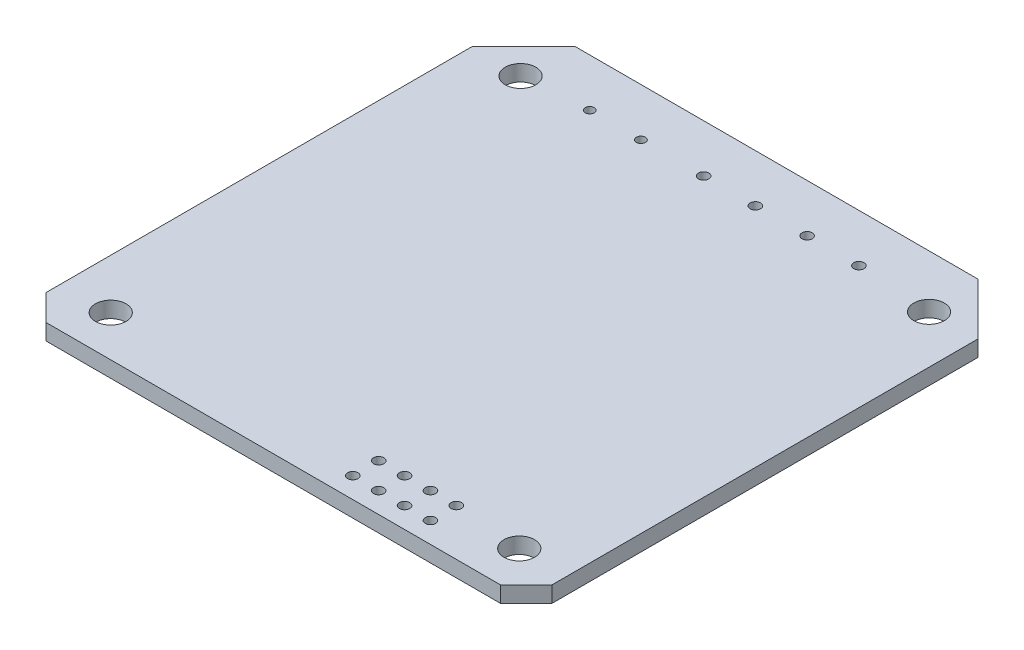
ISO-10303-21;
HEADER;
FILE_DESCRIPTION(('STEP AP214'),'2;1');
FILE_NAME('part.step','',(''),(''),'','','');
FILE_SCHEMA(('AUTOMOTIVE_DESIGN { 1 0 10303 214 1 1 1 1 }'));
ENDSEC;
DATA;
#1=APPLICATION_CONTEXT('core data for automotive mechanical design processes');
#2=APPLICATION_PROTOCOL_DEFINITION('international standard','automotive_design',2000,#1);
#3=PRODUCT_CONTEXT('',#1,'mechanical');
#4=PRODUCT('Part','Part','',(#3));
#5=PRODUCT_RELATED_PRODUCT_CATEGORY('part','',(#4));
#6=PRODUCT_DEFINITION_FORMATION('','',#4);
#7=PRODUCT_DEFINITION_CONTEXT('part definition',#1,'design');
#8=PRODUCT_DEFINITION('design','',#6,#7);
#9=PRODUCT_DEFINITION_SHAPE('','',#8);
#10=(LENGTH_UNIT() NAMED_UNIT(*) SI_UNIT(.MILLI.,.METRE.));
#11=(NAMED_UNIT(*) PLANE_ANGLE_UNIT() SI_UNIT($,.RADIAN.));
#12=(NAMED_UNIT(*) SI_UNIT($,.STERADIAN.) SOLID_ANGLE_UNIT());
#13=UNCERTAINTY_MEASURE_WITH_UNIT(LENGTH_MEASURE(1.E-05),#10,'distance_accuracy_value','');
#14=(GEOMETRIC_REPRESENTATION_CONTEXT(3) GLOBAL_UNCERTAINTY_ASSIGNED_CONTEXT((#13)) GLOBAL_UNIT_ASSIGNED_CONTEXT((#10,
#11,#12)) REPRESENTATION_CONTEXT('',''));
#15=CARTESIAN_POINT('',(0.,0.,0.));
#16=DIRECTION('',(0.,0.,1.));
#17=DIRECTION('',(1.,0.,0.));
#18=AXIS2_PLACEMENT_3D('',#15,#16,#17);
#19=CARTESIAN_POINT('',(24.8285,1.5748,24.7015));
#20=DIRECTION('',(-1.,0.,0.));
#21=DIRECTION('',(0.,0.,1.));
#22=AXIS2_PLACEMENT_3D('',#19,#20,#21);
#23=PLANE('',#22);
#24=DIRECTION('',(0.,0.,-1.));
#25=VECTOR('',#24,1.);
#26=CARTESIAN_POINT('',(24.8285,1.5748,24.7015));
#27=LINE('',#26,#25);
#28=CARTESIAN_POINT('',(24.8285,1.5748,22.1615));
#29=VERTEX_POINT('',#28);
#30=CARTESIAN_POINT('',(24.8285,1.5748,-19.6215));
#31=VERTEX_POINT('',#30);
#32=EDGE_CURVE('E139',#29,#31,#27,.T.);
#33=ORIENTED_EDGE('',*,*,#32,.F.);
#34=DIRECTION('',(0.,-1.,0.));
#35=VECTOR('',#34,1.);
#36=CARTESIAN_POINT('',(24.8285,1.5748,22.1615));
#37=LINE('',#36,#35);
#38=CARTESIAN_POINT('',(24.8285,0.,22.1615));
#39=VERTEX_POINT('',#38);
#40=EDGE_CURVE('E151',#29,#39,#37,.T.);
#41=ORIENTED_EDGE('',*,*,#40,.T.);
#42=DIRECTION('',(0.,0.,-1.));
#43=VECTOR('',#42,1.);
#44=CARTESIAN_POINT('',(24.8285,0.,24.7015));
#45=LINE('',#44,#43);
#46=CARTESIAN_POINT('',(24.8285,0.,-19.6215));
#47=VERTEX_POINT('',#46);
#48=EDGE_CURVE('E130',#39,#47,#45,.T.);
#49=ORIENTED_EDGE('',*,*,#48,.T.);
#50=DIRECTION('',(0.,1.,0.));
#51=VECTOR('',#50,1.);
#52=CARTESIAN_POINT('',(24.8285,1.5748,-19.6215));
#53=LINE('',#52,#51);
#54=EDGE_CURVE('E111',#47,#31,#53,.T.);
#55=ORIENTED_EDGE('',*,*,#54,.T.);
#56=EDGE_LOOP('',(#33,#41,#49,#55));
#57=FACE_BOUND('',#56,.T.);
#58=ADVANCED_FACE('F35',(#57),#23,.F.);
#59=CARTESIAN_POINT('',(-24.8285,1.5748,-24.7015));
#60=DIRECTION('',(0.,0.,1.));
#61=DIRECTION('',(1.,0.,0.));
#62=AXIS2_PLACEMENT_3D('',#59,#60,#61);
#63=PLANE('',#62);
#64=DIRECTION('',(-1.,0.,0.));
#65=VECTOR('',#64,1.);
#66=CARTESIAN_POINT('',(-24.8285,1.5748,-24.7015));
#67=LINE('',#66,#65);
#68=CARTESIAN_POINT('',(19.7485,1.5748,-24.7015));
#69=VERTEX_POINT('',#68);
#70=CARTESIAN_POINT('',(-19.7485,1.5748,-24.7015));
#71=VERTEX_POINT('',#70);
#72=EDGE_CURVE('E124',#69,#71,#67,.T.);
#73=ORIENTED_EDGE('',*,*,#72,.F.);
#74=DIRECTION('',(0.,-1.,0.));
#75=VECTOR('',#74,1.);
#76=CARTESIAN_POINT('',(19.7485,1.5748,-24.7015));
#77=LINE('',#76,#75);
#78=CARTESIAN_POINT('',(19.7485,0.,-24.7015));
#79=VERTEX_POINT('',#78);
#80=EDGE_CURVE('E109',#69,#79,#77,.T.);
#81=ORIENTED_EDGE('',*,*,#80,.T.);
#82=DIRECTION('',(-1.,0.,0.));
#83=VECTOR('',#82,1.);
#84=CARTESIAN_POINT('',(-24.8285,0.,-24.7015));
#85=LINE('',#84,#83);
#86=CARTESIAN_POINT('',(-19.7485,0.,-24.7015));
#87=VERTEX_POINT('',#86);
#88=EDGE_CURVE('E121',#79,#87,#85,.T.);
#89=ORIENTED_EDGE('',*,*,#88,.T.);
#90=DIRECTION('',(0.,1.,0.));
#91=VECTOR('',#90,1.);
#92=CARTESIAN_POINT('',(-19.7485,1.5748,-24.7015));
#93=LINE('',#92,#91);
#94=EDGE_CURVE('E125',#87,#71,#93,.T.);
#95=ORIENTED_EDGE('',*,*,#94,.T.);
#96=EDGE_LOOP('',(#73,#81,#89,#95));
#97=FACE_BOUND('',#96,.T.);
#98=ADVANCED_FACE('F120',(#97),#63,.F.);
#99=CARTESIAN_POINT('',(-24.8285,1.5748,24.7015));
#100=DIRECTION('',(1.,0.,0.));
#101=DIRECTION('',(0.,0.,-1.));
#102=AXIS2_PLACEMENT_3D('',#99,#100,#101);
#103=PLANE('',#102);
#104=DIRECTION('',(0.,0.,1.));
#105=VECTOR('',#104,1.);
#106=CARTESIAN_POINT('',(-24.8285,0.,24.7015));
#107=LINE('',#106,#105);
#108=CARTESIAN_POINT('',(-24.8285,0.,-19.6215));
#109=VERTEX_POINT('',#108);
#110=CARTESIAN_POINT('',(-24.8285,0.,22.1615));
#111=VERTEX_POINT('',#110);
#112=EDGE_CURVE('E129',#109,#111,#107,.T.);
#113=ORIENTED_EDGE('',*,*,#112,.T.);
#114=DIRECTION('',(0.,1.,0.));
#115=VECTOR('',#114,1.);
#116=CARTESIAN_POINT('',(-24.8285,1.5748,22.1615));
#117=LINE('',#116,#115);
#118=CARTESIAN_POINT('',(-24.8285,1.5748,22.1615));
#119=VERTEX_POINT('',#118);
#120=EDGE_CURVE('E11',#111,#119,#117,.T.);
#121=ORIENTED_EDGE('',*,*,#120,.T.);
#122=DIRECTION('',(0.,0.,1.));
#123=VECTOR('',#122,1.);
#124=CARTESIAN_POINT('',(-24.8285,1.5748,24.7015));
#125=LINE('',#124,#123);
#126=CARTESIAN_POINT('',(-24.8285,1.5748,-19.6215));
#127=VERTEX_POINT('',#126);
#128=EDGE_CURVE('E274',#127,#119,#125,.T.);
#129=ORIENTED_EDGE('',*,*,#128,.F.);
#130=DIRECTION('',(0.,-1.,0.));
#131=VECTOR('',#130,1.);
#132=CARTESIAN_POINT('',(-24.8285,1.5748,-19.6215));
#133=LINE('',#132,#131);
#134=EDGE_CURVE('E148',#127,#109,#133,.T.);
#135=ORIENTED_EDGE('',*,*,#134,.T.);
#136=EDGE_LOOP('',(#113,#121,#129,#135));
#137=FACE_BOUND('',#136,.T.);
#138=ADVANCED_FACE('F288',(#137),#103,.F.);
#139=CARTESIAN_POINT('',(-24.8285,1.5748,24.7015));
#140=DIRECTION('',(0.,0.,-1.));
#141=DIRECTION('',(-1.,0.,0.));
#142=AXIS2_PLACEMENT_3D('',#139,#140,#141);
#143=PLANE('',#142);
#144=DIRECTION('',(1.,0.,0.));
#145=VECTOR('',#144,1.);
#146=CARTESIAN_POINT('',(-24.8285,0.,24.7015));
#147=LINE('',#146,#145);
#148=CARTESIAN_POINT('',(-22.2885,0.,24.7015));
#149=VERTEX_POINT('',#148);
#150=CARTESIAN_POINT('',(22.2885,0.,24.7015));
#151=VERTEX_POINT('',#150);
#152=EDGE_CURVE('E132',#149,#151,#147,.T.);
#153=ORIENTED_EDGE('',*,*,#152,.T.);
#154=DIRECTION('',(0.,1.,0.));
#155=VECTOR('',#154,1.);
#156=CARTESIAN_POINT('',(22.2885,1.5748,24.7015));
#157=LINE('',#156,#155);
#158=CARTESIAN_POINT('',(22.2884999999999,1.5748,24.7015));
#159=VERTEX_POINT('',#158);
#160=EDGE_CURVE('E58',#151,#159,#157,.T.);
#161=ORIENTED_EDGE('',*,*,#160,.T.);
#162=DIRECTION('',(1.,0.,0.));
#163=VECTOR('',#162,1.);
#164=CARTESIAN_POINT('',(-24.8285,1.5748,24.7015));
#165=LINE('',#164,#163);
#166=CARTESIAN_POINT('',(-22.2885,1.5748,24.7015));
#167=VERTEX_POINT('',#166);
#168=EDGE_CURVE('E140',#167,#159,#165,.T.);
#169=ORIENTED_EDGE('',*,*,#168,.F.);
#170=DIRECTION('',(0.,-1.,0.));
#171=VECTOR('',#170,1.);
#172=CARTESIAN_POINT('',(-22.2885,1.5748,24.7015));
#173=LINE('',#172,#171);
#174=EDGE_CURVE('E158',#167,#149,#173,.T.);
#175=ORIENTED_EDGE('',*,*,#174,.T.);
#176=EDGE_LOOP('',(#153,#161,#169,#175));
#177=FACE_BOUND('',#176,.T.);
#178=ADVANCED_FACE('F286',(#177),#143,.F.);
#179=CARTESIAN_POINT('',(0.,1.5748,0.));
#180=DIRECTION('',(0.,-1.,0.));
#181=DIRECTION('',(0.,0.,-1.));
#182=AXIS2_PLACEMENT_3D('',#179,#180,#181);
#183=PLANE('',#182);
#184=CARTESIAN_POINT('',(12.7635,1.5748,-20.0025));
#185=DIRECTION('',(0.,1.,0.));
#186=DIRECTION('',(0.,0.,1.));
#187=AXIS2_PLACEMENT_3D('',#184,#185,#186);
#188=CIRCLE('',#187,0.508);
#189=CARTESIAN_POINT('',(12.7635,1.5748,-19.4945));
#190=VERTEX_POINT('',#189);
#191=EDGE_CURVE('E193',#190,#190,#188,.T.);
#192=ORIENTED_EDGE('',*,*,#191,.F.);
#193=EDGE_LOOP('',(#192));
#194=FACE_BOUND('',#193,.T.);
#195=CARTESIAN_POINT('',(7.6835,1.5748,-20.0025));
#196=DIRECTION('',(0.,1.,0.));
#197=DIRECTION('',(0.,0.,1.));
#198=AXIS2_PLACEMENT_3D('',#195,#196,#197);
#199=CIRCLE('',#198,0.508000000000003);
#200=CARTESIAN_POINT('',(7.6835,1.5748,-19.4945));
#201=VERTEX_POINT('',#200);
#202=EDGE_CURVE('E183',#201,#201,#199,.T.);
#203=ORIENTED_EDGE('',*,*,#202,.F.);
#204=EDGE_LOOP('',(#203));
#205=FACE_BOUND('',#204,.T.);
#206=CARTESIAN_POINT('',(2.6035,1.5748,-20.0025));
#207=DIRECTION('',(0.,1.,0.));
#208=DIRECTION('',(0.,0.,1.));
#209=AXIS2_PLACEMENT_3D('',#206,#207,#208);
#210=CIRCLE('',#209,0.508000000000001);
#211=CARTESIAN_POINT('',(2.6035,1.5748,-19.4945));
#212=VERTEX_POINT('',#211);
#213=EDGE_CURVE('E180',#212,#212,#210,.T.);
#214=ORIENTED_EDGE('',*,*,#213,.F.);
#215=EDGE_LOOP('',(#214));
#216=FACE_BOUND('',#215,.T.);
#217=CARTESIAN_POINT('',(-2.4765,1.5748,-20.0025));
#218=DIRECTION('',(0.,1.,0.));
#219=DIRECTION('',(0.,0.,1.));
#220=AXIS2_PLACEMENT_3D('',#217,#218,#219);
#221=CIRCLE('',#220,0.508000000000002);
#222=CARTESIAN_POINT('',(-2.4765,1.5748,-19.4945));
#223=VERTEX_POINT('',#222);
#224=EDGE_CURVE('E177',#223,#223,#221,.T.);
#225=ORIENTED_EDGE('',*,*,#224,.F.);
#226=EDGE_LOOP('',(#225));
#227=FACE_BOUND('',#226,.T.);
#228=CARTESIAN_POINT('',(-8.6233,1.5748,-20.0025));
#229=DIRECTION('',(0.,1.,0.));
#230=DIRECTION('',(0.,0.,1.));
#231=AXIS2_PLACEMENT_3D('',#228,#229,#230);
#232=CIRCLE('',#231,0.4445);
#233=CARTESIAN_POINT('',(-8.6233,1.5748,-19.558));
#234=VERTEX_POINT('',#233);
#235=EDGE_CURVE('E173',#234,#234,#232,.T.);
#236=ORIENTED_EDGE('',*,*,#235,.F.);
#237=EDGE_LOOP('',(#236));
#238=FACE_BOUND('',#237,.T.);
#239=CARTESIAN_POINT('',(-13.6513774099703,1.5748,-20.0025));
#240=DIRECTION('',(0.,1.,0.));
#241=DIRECTION('',(0.,0.,1.));
#242=AXIS2_PLACEMENT_3D('',#239,#240,#241);
#243=CIRCLE('',#242,0.4445);
#244=CARTESIAN_POINT('',(-13.6513774099703,1.5748,-19.558));
#245=VERTEX_POINT('',#244);
#246=EDGE_CURVE('E169',#245,#245,#243,.T.);
#247=ORIENTED_EDGE('',*,*,#246,.F.);
#248=EDGE_LOOP('',(#247));
#249=FACE_BOUND('',#248,.T.);
#250=CARTESIAN_POINT('',(5.77849999999999,1.5748,22.6695));
#251=DIRECTION('',(0.,1.,0.));
#252=DIRECTION('',(0.,0.,1.));
#253=AXIS2_PLACEMENT_3D('',#250,#251,#252);
#254=CIRCLE('',#253,0.508000000000001);
#255=CARTESIAN_POINT('',(5.77849999999999,1.5748,23.1775));
#256=VERTEX_POINT('',#255);
#257=EDGE_CURVE('E168',#256,#256,#254,.T.);
#258=ORIENTED_EDGE('',*,*,#257,.F.);
#259=EDGE_LOOP('',(#258));
#260=FACE_BOUND('',#259,.T.);
#261=CARTESIAN_POINT('',(8.31849999999999,1.5748,22.6695));
#262=DIRECTION('',(0.,1.,0.));
#263=DIRECTION('',(0.,0.,1.));
#264=AXIS2_PLACEMENT_3D('',#261,#262,#263);
#265=CIRCLE('',#264,0.508000000000002);
#266=CARTESIAN_POINT('',(8.31849999999999,1.5748,23.1775));
#267=VERTEX_POINT('',#266);
#268=EDGE_CURVE('E205',#267,#267,#265,.T.);
#269=ORIENTED_EDGE('',*,*,#268,.F.);
#270=EDGE_LOOP('',(#269));
#271=FACE_BOUND('',#270,.T.);
#272=CARTESIAN_POINT('',(10.8585,1.5748,22.6695));
#273=DIRECTION('',(0.,1.,0.));
#274=DIRECTION('',(0.,0.,1.));
#275=AXIS2_PLACEMENT_3D('',#272,#273,#274);
#276=CIRCLE('',#275,0.508000000000002);
#277=CARTESIAN_POINT('',(10.8585,1.5748,23.1775));
#278=VERTEX_POINT('',#277);
#279=EDGE_CURVE('E211',#278,#278,#276,.T.);
#280=ORIENTED_EDGE('',*,*,#279,.F.);
#281=EDGE_LOOP('',(#280));
#282=FACE_BOUND('',#281,.T.);
#283=CARTESIAN_POINT('',(13.3985,1.5748,22.6695));
#284=DIRECTION('',(0.,1.,0.));
#285=DIRECTION('',(0.,0.,1.));
#286=AXIS2_PLACEMENT_3D('',#283,#284,#285);
#287=CIRCLE('',#286,0.508);
#288=CARTESIAN_POINT('',(13.3985,1.5748,23.1775));
#289=VERTEX_POINT('',#288);
#290=EDGE_CURVE('E217',#289,#289,#287,.T.);
#291=ORIENTED_EDGE('',*,*,#290,.F.);
#292=EDGE_LOOP('',(#291));
#293=FACE_BOUND('',#292,.T.);
#294=CARTESIAN_POINT('',(13.3985,1.5748,20.1295));
#295=DIRECTION('',(0.,1.,0.));
#296=DIRECTION('',(0.,0.,1.));
#297=AXIS2_PLACEMENT_3D('',#294,#295,#296);
#298=CIRCLE('',#297,0.508);
#299=CARTESIAN_POINT('',(13.3985,1.5748,20.6375));
#300=VERTEX_POINT('',#299);
#301=EDGE_CURVE('E223',#300,#300,#298,.T.);
#302=ORIENTED_EDGE('',*,*,#301,.F.);
#303=EDGE_LOOP('',(#302));
#304=FACE_BOUND('',#303,.T.);
#305=CARTESIAN_POINT('',(10.8585,1.5748,20.1295));
#306=DIRECTION('',(0.,1.,0.));
#307=DIRECTION('',(0.,0.,1.));
#308=AXIS2_PLACEMENT_3D('',#305,#306,#307);
#309=CIRCLE('',#308,0.508000000000002);
#310=CARTESIAN_POINT('',(10.8585,1.5748,20.6375));
#311=VERTEX_POINT('',#310);
#312=EDGE_CURVE('E229',#311,#311,#309,.T.);
#313=ORIENTED_EDGE('',*,*,#312,.F.);
#314=EDGE_LOOP('',(#313));
#315=FACE_BOUND('',#314,.T.);
#316=CARTESIAN_POINT('',(8.31849999999999,1.5748,20.1295));
#317=DIRECTION('',(0.,1.,0.));
#318=DIRECTION('',(0.,0.,1.));
#319=AXIS2_PLACEMENT_3D('',#316,#317,#318);
#320=CIRCLE('',#319,0.508000000000002);
#321=CARTESIAN_POINT('',(8.31849999999999,1.5748,20.6375));
#322=VERTEX_POINT('',#321);
#323=EDGE_CURVE('E235',#322,#322,#320,.T.);
#324=ORIENTED_EDGE('',*,*,#323,.F.);
#325=EDGE_LOOP('',(#324));
#326=FACE_BOUND('',#325,.T.);
#327=CARTESIAN_POINT('',(5.77849999999999,1.5748,20.1295));
#328=DIRECTION('',(0.,1.,0.));
#329=DIRECTION('',(0.,0.,1.));
#330=AXIS2_PLACEMENT_3D('',#327,#328,#329);
#331=CIRCLE('',#330,0.508000000000001);
#332=CARTESIAN_POINT('',(5.77849999999999,1.5748,20.6375));
#333=VERTEX_POINT('',#332);
#334=EDGE_CURVE('E241',#333,#333,#331,.T.);
#335=ORIENTED_EDGE('',*,*,#334,.F.);
#336=EDGE_LOOP('',(#335));
#337=FACE_BOUND('',#336,.T.);
#338=CARTESIAN_POINT('',(-19.9517,1.5748,20.6883));
#339=DIRECTION('',(0.,1.,0.));
#340=DIRECTION('',(0.,0.,1.));
#341=AXIS2_PLACEMENT_3D('',#338,#339,#340);
#342=CIRCLE('',#341,1.5);
#343=CARTESIAN_POINT('',(-19.9517,1.5748,22.1883));
#344=VERTEX_POINT('',#343);
#345=EDGE_CURVE('E247',#344,#344,#342,.T.);
#346=ORIENTED_EDGE('',*,*,#345,.F.);
#347=EDGE_LOOP('',(#346));
#348=FACE_BOUND('',#347,.T.);
#349=CARTESIAN_POINT('',(20.1295,1.5748,20.6883));
#350=DIRECTION('',(0.,1.,0.));
#351=DIRECTION('',(0.,0.,1.));
#352=AXIS2_PLACEMENT_3D('',#349,#350,#351);
#353=CIRCLE('',#352,1.5);
#354=CARTESIAN_POINT('',(20.1295,1.5748,22.1883));
#355=VERTEX_POINT('',#354);
#356=EDGE_CURVE('E253',#355,#355,#353,.T.);
#357=ORIENTED_EDGE('',*,*,#356,.F.);
#358=EDGE_LOOP('',(#357));
#359=FACE_BOUND('',#358,.T.);
#360=CARTESIAN_POINT('',(20.1295,1.5748,-19.5199));
#361=DIRECTION('',(0.,1.,0.));
#362=DIRECTION('',(0.,0.,1.));
#363=AXIS2_PLACEMENT_3D('',#360,#361,#362);
#364=CIRCLE('',#363,1.5);
#365=CARTESIAN_POINT('',(20.1295,1.5748,-18.0199));
#366=VERTEX_POINT('',#365);
#367=EDGE_CURVE('E259',#366,#366,#364,.T.);
#368=ORIENTED_EDGE('',*,*,#367,.F.);
#369=EDGE_LOOP('',(#368));
#370=FACE_BOUND('',#369,.T.);
#371=CARTESIAN_POINT('',(-19.9517,1.5748,-19.5199));
#372=DIRECTION('',(0.,1.,0.));
#373=DIRECTION('',(0.,0.,1.));
#374=AXIS2_PLACEMENT_3D('',#371,#372,#373);
#375=CIRCLE('',#374,1.5);
#376=CARTESIAN_POINT('',(-19.9517,1.5748,-18.0199));
#377=VERTEX_POINT('',#376);
#378=EDGE_CURVE('E265',#377,#377,#375,.T.);
#379=ORIENTED_EDGE('',*,*,#378,.F.);
#380=EDGE_LOOP('',(#379));
#381=FACE_BOUND('',#380,.T.);
#382=ORIENTED_EDGE('',*,*,#168,.T.);
#383=DIRECTION('',(-0.707106781186549,0.,0.707106781186547));
#384=VECTOR('',#383,1.);
#385=CARTESIAN_POINT('',(24.8285,1.5748,22.1615));
#386=LINE('',#385,#384);
#387=EDGE_CURVE('E44',#159,#29,#386,.F.);
#388=ORIENTED_EDGE('',*,*,#387,.T.);
#389=ORIENTED_EDGE('',*,*,#32,.T.);
#390=DIRECTION('',(0.707106781186547,0.,0.707106781186549));
#391=VECTOR('',#390,1.);
#392=CARTESIAN_POINT('',(19.7485,1.5748,-24.7015));
#393=LINE('',#392,#391);
#394=EDGE_CURVE('E146',#31,#69,#393,.F.);
#395=ORIENTED_EDGE('',*,*,#394,.T.);
#396=ORIENTED_EDGE('',*,*,#72,.T.);
#397=DIRECTION('',(0.707106781186549,0.,-0.707106781186547));
#398=VECTOR('',#397,1.);
#399=CARTESIAN_POINT('',(-24.8285,1.5748,-19.6215));
#400=LINE('',#399,#398);
#401=EDGE_CURVE('E144',#71,#127,#400,.F.);
#402=ORIENTED_EDGE('',*,*,#401,.T.);
#403=ORIENTED_EDGE('',*,*,#128,.T.);
#404=DIRECTION('',(-0.707106781186546,0.,-0.70710678118655));
#405=VECTOR('',#404,1.);
#406=CARTESIAN_POINT('',(-22.2885,1.5748,24.7015));
#407=LINE('',#406,#405);
#408=EDGE_CURVE('E162',#119,#167,#407,.F.);
#409=ORIENTED_EDGE('',*,*,#408,.T.);
#410=EDGE_LOOP('',(#382,#388,#389,#395,#396,#402,#403,#409));
#411=FACE_BOUND('',#410,.T.);
#412=ADVANCED_FACE('F277',(#194,#205,#216,#227,#238,#249,#260,#271,#282,#293,#304,#315,#326,
#337,#348,#359,#370,#381,#411),#183,.F.);
#413=CARTESIAN_POINT('',(0.,0.,0.));
#414=DIRECTION('',(0.,-1.,0.));
#415=DIRECTION('',(0.,0.,-1.));
#416=AXIS2_PLACEMENT_3D('',#413,#414,#415);
#417=PLANE('',#416);
#418=CARTESIAN_POINT('',(12.7635,0.,-20.0025));
#419=DIRECTION('',(0.,-1.,0.));
#420=DIRECTION('',(0.,0.,-1.));
#421=AXIS2_PLACEMENT_3D('',#418,#419,#420);
#422=CIRCLE('',#421,0.508);
#423=CARTESIAN_POINT('',(12.7635,0.,-20.5105));
#424=VERTEX_POINT('',#423);
#425=EDGE_CURVE('E39',#424,#424,#422,.T.);
#426=ORIENTED_EDGE('',*,*,#425,.F.);
#427=EDGE_LOOP('',(#426));
#428=FACE_BOUND('',#427,.T.);
#429=CARTESIAN_POINT('',(7.6835,0.,-20.0025));
#430=DIRECTION('',(0.,-1.,0.));
#431=DIRECTION('',(0.,0.,-1.));
#432=AXIS2_PLACEMENT_3D('',#429,#430,#431);
#433=CIRCLE('',#432,0.508000000000003);
#434=CARTESIAN_POINT('',(7.6835,0.,-20.5105));
#435=VERTEX_POINT('',#434);
#436=EDGE_CURVE('E181',#435,#435,#433,.T.);
#437=ORIENTED_EDGE('',*,*,#436,.F.);
#438=EDGE_LOOP('',(#437));
#439=FACE_BOUND('',#438,.T.);
#440=CARTESIAN_POINT('',(2.6035,0.,-20.0025));
#441=DIRECTION('',(0.,-1.,0.));
#442=DIRECTION('',(0.,0.,-1.));
#443=AXIS2_PLACEMENT_3D('',#440,#441,#442);
#444=CIRCLE('',#443,0.508000000000001);
#445=CARTESIAN_POINT('',(2.6035,0.,-20.5105));
#446=VERTEX_POINT('',#445);
#447=EDGE_CURVE('E178',#446,#446,#444,.T.);
#448=ORIENTED_EDGE('',*,*,#447,.F.);
#449=EDGE_LOOP('',(#448));
#450=FACE_BOUND('',#449,.T.);
#451=CARTESIAN_POINT('',(-2.4765,0.,-20.0025));
#452=DIRECTION('',(0.,-1.,0.));
#453=DIRECTION('',(0.,0.,-1.));
#454=AXIS2_PLACEMENT_3D('',#451,#452,#453);
#455=CIRCLE('',#454,0.508000000000002);
#456=CARTESIAN_POINT('',(-2.4765,0.,-20.5105));
#457=VERTEX_POINT('',#456);
#458=EDGE_CURVE('E174',#457,#457,#455,.T.);
#459=ORIENTED_EDGE('',*,*,#458,.F.);
#460=EDGE_LOOP('',(#459));
#461=FACE_BOUND('',#460,.T.);
#462=CARTESIAN_POINT('',(-8.6233,0.,-20.0025));
#463=DIRECTION('',(0.,-1.,0.));
#464=DIRECTION('',(0.,0.,-1.));
#465=AXIS2_PLACEMENT_3D('',#462,#463,#464);
#466=CIRCLE('',#465,0.4445);
#467=CARTESIAN_POINT('',(-8.6233,0.,-20.447));
#468=VERTEX_POINT('',#467);
#469=EDGE_CURVE('E170',#468,#468,#466,.T.);
#470=ORIENTED_EDGE('',*,*,#469,.F.);
#471=EDGE_LOOP('',(#470));
#472=FACE_BOUND('',#471,.T.);
#473=CARTESIAN_POINT('',(-13.6513774099703,0.,-20.0025));
#474=DIRECTION('',(0.,-1.,0.));
#475=DIRECTION('',(0.,0.,-1.));
#476=AXIS2_PLACEMENT_3D('',#473,#474,#475);
#477=CIRCLE('',#476,0.4445);
#478=CARTESIAN_POINT('',(-13.6513774099703,0.,-20.447));
#479=VERTEX_POINT('',#478);
#480=EDGE_CURVE('E165',#479,#479,#477,.T.);
#481=ORIENTED_EDGE('',*,*,#480,.F.);
#482=EDGE_LOOP('',(#481));
#483=FACE_BOUND('',#482,.T.);
#484=CARTESIAN_POINT('',(5.77849999999999,0.,22.6695));
#485=DIRECTION('',(0.,1.,0.));
#486=DIRECTION('',(0.,0.,1.));
#487=AXIS2_PLACEMENT_3D('',#484,#485,#486);
#488=CIRCLE('',#487,0.508000000000001);
#489=CARTESIAN_POINT('',(5.77849999999999,0.,23.1775));
#490=VERTEX_POINT('',#489);
#491=EDGE_CURVE('E202',#490,#490,#488,.T.);
#492=ORIENTED_EDGE('',*,*,#491,.T.);
#493=EDGE_LOOP('',(#492));
#494=FACE_BOUND('',#493,.T.);
#495=CARTESIAN_POINT('',(8.31849999999999,0.,22.6695));
#496=DIRECTION('',(0.,1.,0.));
#497=DIRECTION('',(0.,0.,1.));
#498=AXIS2_PLACEMENT_3D('',#495,#496,#497);
#499=CIRCLE('',#498,0.508000000000002);
#500=CARTESIAN_POINT('',(8.31849999999999,0.,23.1775));
#501=VERTEX_POINT('',#500);
#502=EDGE_CURVE('E208',#501,#501,#499,.T.);
#503=ORIENTED_EDGE('',*,*,#502,.T.);
#504=EDGE_LOOP('',(#503));
#505=FACE_BOUND('',#504,.T.);
#506=CARTESIAN_POINT('',(10.8585,0.,22.6695));
#507=DIRECTION('',(0.,1.,0.));
#508=DIRECTION('',(0.,0.,1.));
#509=AXIS2_PLACEMENT_3D('',#506,#507,#508);
#510=CIRCLE('',#509,0.508000000000002);
#511=CARTESIAN_POINT('',(10.8585,0.,23.1775));
#512=VERTEX_POINT('',#511);
#513=EDGE_CURVE('E214',#512,#512,#510,.T.);
#514=ORIENTED_EDGE('',*,*,#513,.T.);
#515=EDGE_LOOP('',(#514));
#516=FACE_BOUND('',#515,.T.);
#517=CARTESIAN_POINT('',(13.3985,0.,22.6695));
#518=DIRECTION('',(0.,1.,0.));
#519=DIRECTION('',(0.,0.,1.));
#520=AXIS2_PLACEMENT_3D('',#517,#518,#519);
#521=CIRCLE('',#520,0.508);
#522=CARTESIAN_POINT('',(13.3985,0.,23.1775));
#523=VERTEX_POINT('',#522);
#524=EDGE_CURVE('E220',#523,#523,#521,.T.);
#525=ORIENTED_EDGE('',*,*,#524,.T.);
#526=EDGE_LOOP('',(#525));
#527=FACE_BOUND('',#526,.T.);
#528=CARTESIAN_POINT('',(13.3985,0.,20.1295));
#529=DIRECTION('',(0.,1.,0.));
#530=DIRECTION('',(0.,0.,1.));
#531=AXIS2_PLACEMENT_3D('',#528,#529,#530);
#532=CIRCLE('',#531,0.508);
#533=CARTESIAN_POINT('',(13.3985,0.,20.6375));
#534=VERTEX_POINT('',#533);
#535=EDGE_CURVE('E226',#534,#534,#532,.T.);
#536=ORIENTED_EDGE('',*,*,#535,.T.);
#537=EDGE_LOOP('',(#536));
#538=FACE_BOUND('',#537,.T.);
#539=CARTESIAN_POINT('',(10.8585,0.,20.1295));
#540=DIRECTION('',(0.,1.,0.));
#541=DIRECTION('',(0.,0.,1.));
#542=AXIS2_PLACEMENT_3D('',#539,#540,#541);
#543=CIRCLE('',#542,0.508000000000002);
#544=CARTESIAN_POINT('',(10.8585,0.,20.6375));
#545=VERTEX_POINT('',#544);
#546=EDGE_CURVE('E232',#545,#545,#543,.T.);
#547=ORIENTED_EDGE('',*,*,#546,.T.);
#548=EDGE_LOOP('',(#547));
#549=FACE_BOUND('',#548,.T.);
#550=CARTESIAN_POINT('',(8.31849999999999,0.,20.1295));
#551=DIRECTION('',(0.,1.,0.));
#552=DIRECTION('',(0.,0.,1.));
#553=AXIS2_PLACEMENT_3D('',#550,#551,#552);
#554=CIRCLE('',#553,0.508000000000002);
#555=CARTESIAN_POINT('',(8.31849999999999,0.,20.6375));
#556=VERTEX_POINT('',#555);
#557=EDGE_CURVE('E238',#556,#556,#554,.T.);
#558=ORIENTED_EDGE('',*,*,#557,.T.);
#559=EDGE_LOOP('',(#558));
#560=FACE_BOUND('',#559,.T.);
#561=CARTESIAN_POINT('',(5.77849999999999,0.,20.1295));
#562=DIRECTION('',(0.,1.,0.));
#563=DIRECTION('',(0.,0.,1.));
#564=AXIS2_PLACEMENT_3D('',#561,#562,#563);
#565=CIRCLE('',#564,0.508000000000001);
#566=CARTESIAN_POINT('',(5.77849999999999,0.,20.6375));
#567=VERTEX_POINT('',#566);
#568=EDGE_CURVE('E244',#567,#567,#565,.T.);
#569=ORIENTED_EDGE('',*,*,#568,.T.);
#570=EDGE_LOOP('',(#569));
#571=FACE_BOUND('',#570,.T.);
#572=CARTESIAN_POINT('',(-19.9517,0.,20.6883));
#573=DIRECTION('',(0.,1.,0.));
#574=DIRECTION('',(0.,0.,1.));
#575=AXIS2_PLACEMENT_3D('',#572,#573,#574);
#576=CIRCLE('',#575,1.5);
#577=CARTESIAN_POINT('',(-19.9517,0.,22.1883));
#578=VERTEX_POINT('',#577);
#579=EDGE_CURVE('E250',#578,#578,#576,.T.);
#580=ORIENTED_EDGE('',*,*,#579,.T.);
#581=EDGE_LOOP('',(#580));
#582=FACE_BOUND('',#581,.T.);
#583=CARTESIAN_POINT('',(20.1295,0.,20.6883));
#584=DIRECTION('',(0.,1.,0.));
#585=DIRECTION('',(0.,0.,1.));
#586=AXIS2_PLACEMENT_3D('',#583,#584,#585);
#587=CIRCLE('',#586,1.5);
#588=CARTESIAN_POINT('',(20.1295,0.,22.1883));
#589=VERTEX_POINT('',#588);
#590=EDGE_CURVE('E256',#589,#589,#587,.T.);
#591=ORIENTED_EDGE('',*,*,#590,.T.);
#592=EDGE_LOOP('',(#591));
#593=FACE_BOUND('',#592,.T.);
#594=CARTESIAN_POINT('',(20.1295,0.,-19.5199));
#595=DIRECTION('',(0.,1.,0.));
#596=DIRECTION('',(0.,0.,1.));
#597=AXIS2_PLACEMENT_3D('',#594,#595,#596);
#598=CIRCLE('',#597,1.5);
#599=CARTESIAN_POINT('',(20.1295,0.,-18.0199));
#600=VERTEX_POINT('',#599);
#601=EDGE_CURVE('E262',#600,#600,#598,.T.);
#602=ORIENTED_EDGE('',*,*,#601,.T.);
#603=EDGE_LOOP('',(#602));
#604=FACE_BOUND('',#603,.T.);
#605=CARTESIAN_POINT('',(-19.9517,0.,-19.5199));
#606=DIRECTION('',(0.,1.,0.));
#607=DIRECTION('',(0.,0.,1.));
#608=AXIS2_PLACEMENT_3D('',#605,#606,#607);
#609=CIRCLE('',#608,1.5);
#610=CARTESIAN_POINT('',(-19.9517,0.,-18.0199));
#611=VERTEX_POINT('',#610);
#612=EDGE_CURVE('E134',#611,#611,#609,.T.);
#613=ORIENTED_EDGE('',*,*,#612,.T.);
#614=EDGE_LOOP('',(#613));
#615=FACE_BOUND('',#614,.T.);
#616=ORIENTED_EDGE('',*,*,#48,.F.);
#617=DIRECTION('',(0.707106781186549,0.,-0.707106781186547));
#618=VECTOR('',#617,1.);
#619=CARTESIAN_POINT('',(23.495,0.,23.495));
#620=LINE('',#619,#618);
#621=EDGE_CURVE('E156',#39,#151,#620,.F.);
#622=ORIENTED_EDGE('',*,*,#621,.T.);
#623=ORIENTED_EDGE('',*,*,#152,.F.);
#624=DIRECTION('',(0.707106781186546,0.,0.70710678118655));
#625=VECTOR('',#624,1.);
#626=CARTESIAN_POINT('',(-23.4950000000001,0.,23.4949999999999));
#627=LINE('',#626,#625);
#628=EDGE_CURVE('E154',#149,#111,#627,.F.);
#629=ORIENTED_EDGE('',*,*,#628,.T.);
#630=ORIENTED_EDGE('',*,*,#112,.F.);
#631=DIRECTION('',(-0.707106781186549,0.,0.707106781186547));
#632=VECTOR('',#631,1.);
#633=CARTESIAN_POINT('',(-22.225,0.,-22.225));
#634=LINE('',#633,#632);
#635=EDGE_CURVE('E115',#109,#87,#634,.F.);
#636=ORIENTED_EDGE('',*,*,#635,.T.);
#637=ORIENTED_EDGE('',*,*,#88,.F.);
#638=DIRECTION('',(-0.707106781186547,0.,-0.707106781186549));
#639=VECTOR('',#638,1.);
#640=CARTESIAN_POINT('',(22.225,0.,-22.225));
#641=LINE('',#640,#639);
#642=EDGE_CURVE('E105',#79,#47,#641,.F.);
#643=ORIENTED_EDGE('',*,*,#642,.T.);
#644=EDGE_LOOP('',(#616,#622,#623,#629,#630,#636,#637,#643));
#645=FACE_BOUND('',#644,.T.);
#646=ADVANCED_FACE('F127',(#428,#439,#450,#461,#472,#483,#494,#505,#516,#527,#538,#549,#560,
#571,#582,#593,#604,#615,#645),#417,.T.);
#647=CARTESIAN_POINT('',(19.7485,1.5748,-24.7015));
#648=DIRECTION('',(-0.707106781186549,0.,0.707106781186547));
#649=DIRECTION('',(0.,-1.,0.));
#650=AXIS2_PLACEMENT_3D('',#647,#648,#649);
#651=PLANE('',#650);
#652=ORIENTED_EDGE('',*,*,#394,.F.);
#653=ORIENTED_EDGE('',*,*,#54,.F.);
#654=ORIENTED_EDGE('',*,*,#642,.F.);
#655=ORIENTED_EDGE('',*,*,#80,.F.);
#656=EDGE_LOOP('',(#652,#653,#654,#655));
#657=FACE_BOUND('',#656,.T.);
#658=ADVANCED_FACE('F108',(#657),#651,.F.);
#659=CARTESIAN_POINT('',(-24.8285,1.5748,-19.6215));
#660=DIRECTION('',(0.707106781186547,0.,0.707106781186549));
#661=DIRECTION('',(0.,-1.,0.));
#662=AXIS2_PLACEMENT_3D('',#659,#660,#661);
#663=PLANE('',#662);
#664=ORIENTED_EDGE('',*,*,#401,.F.);
#665=ORIENTED_EDGE('',*,*,#94,.F.);
#666=ORIENTED_EDGE('',*,*,#635,.F.);
#667=ORIENTED_EDGE('',*,*,#134,.F.);
#668=EDGE_LOOP('',(#664,#665,#666,#667));
#669=FACE_BOUND('',#668,.T.);
#670=ADVANCED_FACE('F292',(#669),#663,.F.);
#671=CARTESIAN_POINT('',(24.8285,1.5748,22.1615));
#672=DIRECTION('',(-0.707106781186547,0.,-0.707106781186549));
#673=DIRECTION('',(0.,-1.,0.));
#674=AXIS2_PLACEMENT_3D('',#671,#672,#673);
#675=PLANE('',#674);
#676=ORIENTED_EDGE('',*,*,#387,.F.);
#677=ORIENTED_EDGE('',*,*,#160,.F.);
#678=ORIENTED_EDGE('',*,*,#621,.F.);
#679=ORIENTED_EDGE('',*,*,#40,.F.);
#680=EDGE_LOOP('',(#676,#677,#678,#679));
#681=FACE_BOUND('',#680,.T.);
#682=ADVANCED_FACE('F283',(#681),#675,.F.);
#683=CARTESIAN_POINT('',(-22.2885,1.5748,24.7015));
#684=DIRECTION('',(0.70710678118655,0.,-0.707106781186546));
#685=DIRECTION('',(0.,-1.,0.));
#686=AXIS2_PLACEMENT_3D('',#683,#684,#685);
#687=PLANE('',#686);
#688=ORIENTED_EDGE('',*,*,#408,.F.);
#689=ORIENTED_EDGE('',*,*,#120,.F.);
#690=ORIENTED_EDGE('',*,*,#628,.F.);
#691=ORIENTED_EDGE('',*,*,#174,.F.);
#692=EDGE_LOOP('',(#688,#689,#690,#691));
#693=FACE_BOUND('',#692,.T.);
#694=ADVANCED_FACE('F37',(#693),#687,.F.);
#695=CARTESIAN_POINT('',(-19.9517,0.,-19.5199));
#696=DIRECTION('',(0.,1.,0.));
#697=DIRECTION('',(0.,0.,1.));
#698=AXIS2_PLACEMENT_3D('',#695,#696,#697);
#699=CYLINDRICAL_SURFACE('',#698,1.5);
#700=ORIENTED_EDGE('',*,*,#612,.F.);
#701=EDGE_LOOP('',(#700));
#702=FACE_BOUND('',#701,.T.);
#703=ORIENTED_EDGE('',*,*,#378,.T.);
#704=EDGE_LOOP('',(#703));
#705=FACE_BOUND('',#704,.T.);
#706=ADVANCED_FACE('F317',(#702,#705),#699,.F.);
#707=CARTESIAN_POINT('',(20.1295,0.,-19.5199));
#708=DIRECTION('',(0.,1.,0.));
#709=DIRECTION('',(0.,0.,1.));
#710=AXIS2_PLACEMENT_3D('',#707,#708,#709);
#711=CYLINDRICAL_SURFACE('',#710,1.5);
#712=ORIENTED_EDGE('',*,*,#601,.F.);
#713=EDGE_LOOP('',(#712));
#714=FACE_BOUND('',#713,.T.);
#715=ORIENTED_EDGE('',*,*,#367,.T.);
#716=EDGE_LOOP('',(#715));
#717=FACE_BOUND('',#716,.T.);
#718=ADVANCED_FACE('F320',(#714,#717),#711,.F.);
#719=CARTESIAN_POINT('',(20.1295,0.,20.6883));
#720=DIRECTION('',(0.,1.,0.));
#721=DIRECTION('',(0.,0.,1.));
#722=AXIS2_PLACEMENT_3D('',#719,#720,#721);
#723=CYLINDRICAL_SURFACE('',#722,1.5);
#724=ORIENTED_EDGE('',*,*,#590,.F.);
#725=EDGE_LOOP('',(#724));
#726=FACE_BOUND('',#725,.T.);
#727=ORIENTED_EDGE('',*,*,#356,.T.);
#728=EDGE_LOOP('',(#727));
#729=FACE_BOUND('',#728,.T.);
#730=ADVANCED_FACE('F324',(#726,#729),#723,.F.);
#731=CARTESIAN_POINT('',(-19.9517,0.,20.6883));
#732=DIRECTION('',(0.,1.,0.));
#733=DIRECTION('',(0.,0.,1.));
#734=AXIS2_PLACEMENT_3D('',#731,#732,#733);
#735=CYLINDRICAL_SURFACE('',#734,1.5);
#736=ORIENTED_EDGE('',*,*,#579,.F.);
#737=EDGE_LOOP('',(#736));
#738=FACE_BOUND('',#737,.T.);
#739=ORIENTED_EDGE('',*,*,#345,.T.);
#740=EDGE_LOOP('',(#739));
#741=FACE_BOUND('',#740,.T.);
#742=ADVANCED_FACE('F328',(#738,#741),#735,.F.);
#743=CARTESIAN_POINT('',(5.77849999999999,0.,20.1295));
#744=DIRECTION('',(0.,1.,0.));
#745=DIRECTION('',(0.,0.,1.));
#746=AXIS2_PLACEMENT_3D('',#743,#744,#745);
#747=CYLINDRICAL_SURFACE('',#746,0.508000000000001);
#748=ORIENTED_EDGE('',*,*,#568,.F.);
#749=EDGE_LOOP('',(#748));
#750=FACE_BOUND('',#749,.T.);
#751=ORIENTED_EDGE('',*,*,#334,.T.);
#752=EDGE_LOOP('',(#751));
#753=FACE_BOUND('',#752,.T.);
#754=ADVANCED_FACE('F332',(#750,#753),#747,.F.);
#755=CARTESIAN_POINT('',(8.31849999999999,0.,20.1295));
#756=DIRECTION('',(0.,1.,0.));
#757=DIRECTION('',(0.,0.,1.));
#758=AXIS2_PLACEMENT_3D('',#755,#756,#757);
#759=CYLINDRICAL_SURFACE('',#758,0.508000000000002);
#760=ORIENTED_EDGE('',*,*,#557,.F.);
#761=EDGE_LOOP('',(#760));
#762=FACE_BOUND('',#761,.T.);
#763=ORIENTED_EDGE('',*,*,#323,.T.);
#764=EDGE_LOOP('',(#763));
#765=FACE_BOUND('',#764,.T.);
#766=ADVANCED_FACE('F336',(#762,#765),#759,.F.);
#767=CARTESIAN_POINT('',(10.8585,0.,20.1295));
#768=DIRECTION('',(0.,1.,0.));
#769=DIRECTION('',(0.,0.,1.));
#770=AXIS2_PLACEMENT_3D('',#767,#768,#769);
#771=CYLINDRICAL_SURFACE('',#770,0.508000000000002);
#772=ORIENTED_EDGE('',*,*,#546,.F.);
#773=EDGE_LOOP('',(#772));
#774=FACE_BOUND('',#773,.T.);
#775=ORIENTED_EDGE('',*,*,#312,.T.);
#776=EDGE_LOOP('',(#775));
#777=FACE_BOUND('',#776,.T.);
#778=ADVANCED_FACE('F340',(#774,#777),#771,.F.);
#779=CARTESIAN_POINT('',(13.3985,0.,20.1295));
#780=DIRECTION('',(0.,1.,0.));
#781=DIRECTION('',(0.,0.,1.));
#782=AXIS2_PLACEMENT_3D('',#779,#780,#781);
#783=CYLINDRICAL_SURFACE('',#782,0.508);
#784=ORIENTED_EDGE('',*,*,#535,.F.);
#785=EDGE_LOOP('',(#784));
#786=FACE_BOUND('',#785,.T.);
#787=ORIENTED_EDGE('',*,*,#301,.T.);
#788=EDGE_LOOP('',(#787));
#789=FACE_BOUND('',#788,.T.);
#790=ADVANCED_FACE('F344',(#786,#789),#783,.F.);
#791=CARTESIAN_POINT('',(13.3985,0.,22.6695));
#792=DIRECTION('',(0.,1.,0.));
#793=DIRECTION('',(0.,0.,1.));
#794=AXIS2_PLACEMENT_3D('',#791,#792,#793);
#795=CYLINDRICAL_SURFACE('',#794,0.508);
#796=ORIENTED_EDGE('',*,*,#524,.F.);
#797=EDGE_LOOP('',(#796));
#798=FACE_BOUND('',#797,.T.);
#799=ORIENTED_EDGE('',*,*,#290,.T.);
#800=EDGE_LOOP('',(#799));
#801=FACE_BOUND('',#800,.T.);
#802=ADVANCED_FACE('F348',(#798,#801),#795,.F.);
#803=CARTESIAN_POINT('',(10.8585,0.,22.6695));
#804=DIRECTION('',(0.,1.,0.));
#805=DIRECTION('',(0.,0.,1.));
#806=AXIS2_PLACEMENT_3D('',#803,#804,#805);
#807=CYLINDRICAL_SURFACE('',#806,0.508000000000002);
#808=ORIENTED_EDGE('',*,*,#513,.F.);
#809=EDGE_LOOP('',(#808));
#810=FACE_BOUND('',#809,.T.);
#811=ORIENTED_EDGE('',*,*,#279,.T.);
#812=EDGE_LOOP('',(#811));
#813=FACE_BOUND('',#812,.T.);
#814=ADVANCED_FACE('F352',(#810,#813),#807,.F.);
#815=CARTESIAN_POINT('',(8.31849999999999,0.,22.6695));
#816=DIRECTION('',(0.,1.,0.));
#817=DIRECTION('',(0.,0.,1.));
#818=AXIS2_PLACEMENT_3D('',#815,#816,#817);
#819=CYLINDRICAL_SURFACE('',#818,0.508000000000002);
#820=ORIENTED_EDGE('',*,*,#502,.F.);
#821=EDGE_LOOP('',(#820));
#822=FACE_BOUND('',#821,.T.);
#823=ORIENTED_EDGE('',*,*,#268,.T.);
#824=EDGE_LOOP('',(#823));
#825=FACE_BOUND('',#824,.T.);
#826=ADVANCED_FACE('F356',(#822,#825),#819,.F.);
#827=CARTESIAN_POINT('',(5.77849999999999,0.,22.6695));
#828=DIRECTION('',(0.,1.,0.));
#829=DIRECTION('',(0.,0.,1.));
#830=AXIS2_PLACEMENT_3D('',#827,#828,#829);
#831=CYLINDRICAL_SURFACE('',#830,0.508000000000001);
#832=ORIENTED_EDGE('',*,*,#491,.F.);
#833=EDGE_LOOP('',(#832));
#834=FACE_BOUND('',#833,.T.);
#835=ORIENTED_EDGE('',*,*,#257,.T.);
#836=EDGE_LOOP('',(#835));
#837=FACE_BOUND('',#836,.T.);
#838=ADVANCED_FACE('F360',(#834,#837),#831,.F.);
#839=CARTESIAN_POINT('',(-13.6513774099703,-0.9652,-20.0025));
#840=DIRECTION('',(0.,1.,0.));
#841=DIRECTION('',(0.,0.,1.));
#842=AXIS2_PLACEMENT_3D('',#839,#840,#841);
#843=CYLINDRICAL_SURFACE('',#842,0.4445);
#844=ORIENTED_EDGE('',*,*,#480,.T.);
#845=EDGE_LOOP('',(#844));
#846=FACE_BOUND('',#845,.T.);
#847=ORIENTED_EDGE('',*,*,#246,.T.);
#848=EDGE_LOOP('',(#847));
#849=FACE_BOUND('',#848,.T.);
#850=ADVANCED_FACE('F364',(#846,#849),#843,.F.);
#851=CARTESIAN_POINT('',(-8.6233,-0.9652,-20.0025));
#852=DIRECTION('',(0.,1.,0.));
#853=DIRECTION('',(0.,0.,1.));
#854=AXIS2_PLACEMENT_3D('',#851,#852,#853);
#855=CYLINDRICAL_SURFACE('',#854,0.4445);
#856=ORIENTED_EDGE('',*,*,#469,.T.);
#857=EDGE_LOOP('',(#856));
#858=FACE_BOUND('',#857,.T.);
#859=ORIENTED_EDGE('',*,*,#235,.T.);
#860=EDGE_LOOP('',(#859));
#861=FACE_BOUND('',#860,.T.);
#862=ADVANCED_FACE('F368',(#858,#861),#855,.F.);
#863=CARTESIAN_POINT('',(-2.4765,-0.9652,-20.0025));
#864=DIRECTION('',(0.,1.,0.));
#865=DIRECTION('',(0.,0.,1.));
#866=AXIS2_PLACEMENT_3D('',#863,#864,#865);
#867=CYLINDRICAL_SURFACE('',#866,0.508000000000002);
#868=ORIENTED_EDGE('',*,*,#458,.T.);
#869=EDGE_LOOP('',(#868));
#870=FACE_BOUND('',#869,.T.);
#871=ORIENTED_EDGE('',*,*,#224,.T.);
#872=EDGE_LOOP('',(#871));
#873=FACE_BOUND('',#872,.T.);
#874=ADVANCED_FACE('F372',(#870,#873),#867,.F.);
#875=CARTESIAN_POINT('',(2.6035,-0.9652,-20.0025));
#876=DIRECTION('',(0.,1.,0.));
#877=DIRECTION('',(0.,0.,1.));
#878=AXIS2_PLACEMENT_3D('',#875,#876,#877);
#879=CYLINDRICAL_SURFACE('',#878,0.508000000000001);
#880=ORIENTED_EDGE('',*,*,#447,.T.);
#881=EDGE_LOOP('',(#880));
#882=FACE_BOUND('',#881,.T.);
#883=ORIENTED_EDGE('',*,*,#213,.T.);
#884=EDGE_LOOP('',(#883));
#885=FACE_BOUND('',#884,.T.);
#886=ADVANCED_FACE('F376',(#882,#885),#879,.F.);
#887=CARTESIAN_POINT('',(7.6835,-0.9652,-20.0025));
#888=DIRECTION('',(0.,1.,0.));
#889=DIRECTION('',(0.,0.,1.));
#890=AXIS2_PLACEMENT_3D('',#887,#888,#889);
#891=CYLINDRICAL_SURFACE('',#890,0.508000000000003);
#892=ORIENTED_EDGE('',*,*,#436,.T.);
#893=EDGE_LOOP('',(#892));
#894=FACE_BOUND('',#893,.T.);
#895=ORIENTED_EDGE('',*,*,#202,.T.);
#896=EDGE_LOOP('',(#895));
#897=FACE_BOUND('',#896,.T.);
#898=ADVANCED_FACE('F380',(#894,#897),#891,.F.);
#899=CARTESIAN_POINT('',(12.7635,-0.9652,-20.0025));
#900=DIRECTION('',(0.,1.,0.));
#901=DIRECTION('',(0.,0.,1.));
#902=AXIS2_PLACEMENT_3D('',#899,#900,#901);
#903=CYLINDRICAL_SURFACE('',#902,0.508);
#904=ORIENTED_EDGE('',*,*,#425,.T.);
#905=EDGE_LOOP('',(#904));
#906=FACE_BOUND('',#905,.T.);
#907=ORIENTED_EDGE('',*,*,#191,.T.);
#908=EDGE_LOOP('',(#907));
#909=FACE_BOUND('',#908,.T.);
#910=ADVANCED_FACE('F384',(#906,#909),#903,.F.);
#911=CLOSED_SHELL('',(#58,#98,#138,#178,#412,#646,#658,#670,#682,#694,#706,#718,#730,#742,#754,
#766,#778,#790,#802,#814,#826,#838,#850,#862,#874,#886,#898,#910));
#912=MANIFOLD_SOLID_BREP('B2',#911);
#913=ADVANCED_BREP_SHAPE_REPRESENTATION('',(#18,#912),#14);
#914=SHAPE_DEFINITION_REPRESENTATION(#9,#913);
ENDSEC;
END-ISO-10303-21;
